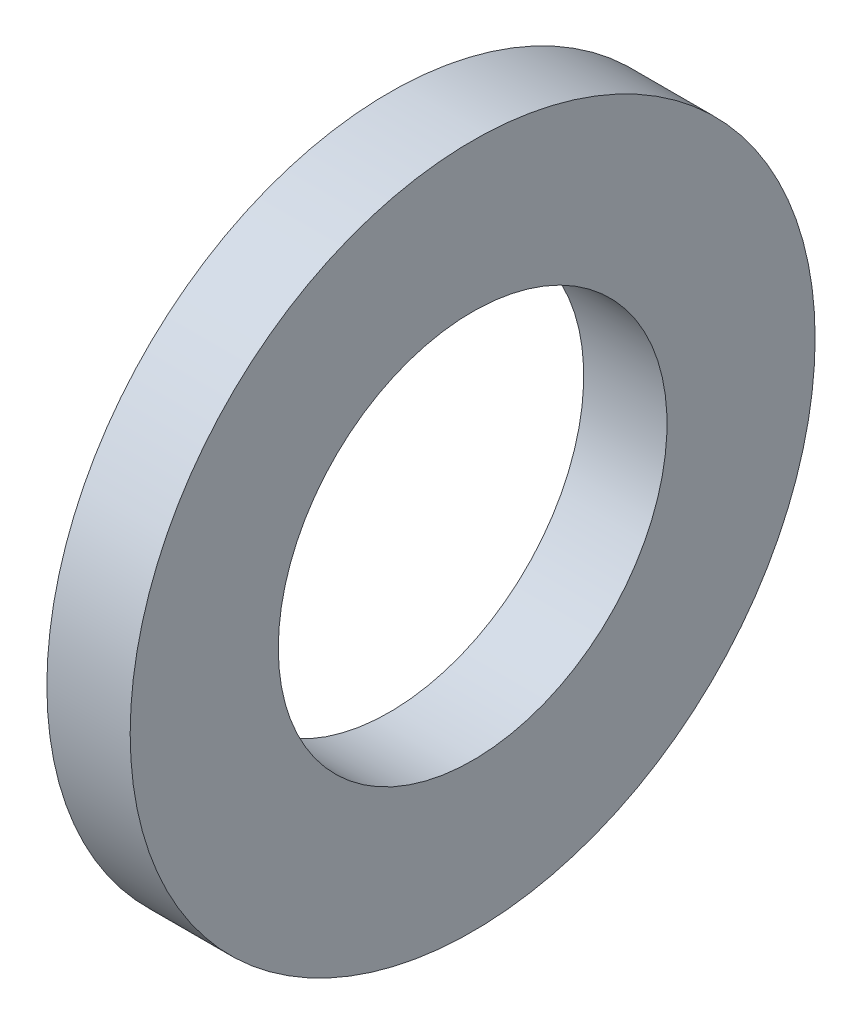
ISO-10303-21;
HEADER;
FILE_DESCRIPTION(('STEP AP214'),'2;1');
FILE_NAME('part.step','',(''),(''),'','','');
FILE_SCHEMA(('AUTOMOTIVE_DESIGN { 1 0 10303 214 1 1 1 1 }'));
ENDSEC;
DATA;
#1=APPLICATION_CONTEXT('core data for automotive mechanical design processes');
#2=APPLICATION_PROTOCOL_DEFINITION('international standard','automotive_design',2000,#1);
#3=PRODUCT_CONTEXT('',#1,'mechanical');
#4=PRODUCT('Part','Part','',(#3));
#5=PRODUCT_RELATED_PRODUCT_CATEGORY('part','',(#4));
#6=PRODUCT_DEFINITION_FORMATION('','',#4);
#7=PRODUCT_DEFINITION_CONTEXT('part definition',#1,'design');
#8=PRODUCT_DEFINITION('design','',#6,#7);
#9=PRODUCT_DEFINITION_SHAPE('','',#8);
#10=(LENGTH_UNIT() NAMED_UNIT(*) SI_UNIT(.MILLI.,.METRE.));
#11=(NAMED_UNIT(*) PLANE_ANGLE_UNIT() SI_UNIT($,.RADIAN.));
#12=(NAMED_UNIT(*) SI_UNIT($,.STERADIAN.) SOLID_ANGLE_UNIT());
#13=UNCERTAINTY_MEASURE_WITH_UNIT(LENGTH_MEASURE(1.E-05),#10,'distance_accuracy_value','');
#14=(GEOMETRIC_REPRESENTATION_CONTEXT(3) GLOBAL_UNCERTAINTY_ASSIGNED_CONTEXT((#13)) GLOBAL_UNIT_ASSIGNED_CONTEXT((#10,
#11,#12)) REPRESENTATION_CONTEXT('',''));
#15=CARTESIAN_POINT('',(0.,0.,0.));
#16=DIRECTION('',(0.,0.,1.));
#17=DIRECTION('',(1.,0.,0.));
#18=AXIS2_PLACEMENT_3D('',#15,#16,#17);
#19=CARTESIAN_POINT('',(-34.9249999999999,0.,0.));
#20=DIRECTION('',(-1.,0.,0.));
#21=DIRECTION('',(0.,0.,1.));
#22=AXIS2_PLACEMENT_3D('',#19,#20,#21);
#23=CYLINDRICAL_SURFACE('',#22,10.5);
#24=CARTESIAN_POINT('',(0.,0.,0.));
#25=DIRECTION('',(-1.,0.,0.));
#26=DIRECTION('',(0.,0.,1.));
#27=AXIS2_PLACEMENT_3D('',#24,#25,#26);
#28=CIRCLE('',#27,10.5);
#29=CARTESIAN_POINT('',(0.,0.,10.5));
#30=VERTEX_POINT('',#29);
#31=EDGE_CURVE('E10',#30,#30,#28,.T.);
#32=ORIENTED_EDGE('',*,*,#31,.F.);
#33=EDGE_LOOP('',(#32));
#34=FACE_BOUND('',#33,.T.);
#35=CARTESIAN_POINT('',(-4.5,0.,0.));
#36=DIRECTION('',(-1.,0.,0.));
#37=DIRECTION('',(0.,0.,1.));
#38=AXIS2_PLACEMENT_3D('',#35,#36,#37);
#39=CIRCLE('',#38,10.5);
#40=CARTESIAN_POINT('',(-4.5,0.,10.5));
#41=VERTEX_POINT('',#40);
#42=EDGE_CURVE('E44',#41,#41,#39,.T.);
#43=ORIENTED_EDGE('',*,*,#42,.T.);
#44=EDGE_LOOP('',(#43));
#45=FACE_BOUND('',#44,.T.);
#46=ADVANCED_FACE('F30',(#34,#45),#23,.F.);
#47=CARTESIAN_POINT('',(0.,10.5,0.));
#48=DIRECTION('',(-1.,0.,0.));
#49=DIRECTION('',(0.,0.,1.));
#50=AXIS2_PLACEMENT_3D('',#47,#48,#49);
#51=PLANE('',#50);
#52=CARTESIAN_POINT('',(0.,0.,0.));
#53=DIRECTION('',(-1.,0.,0.));
#54=DIRECTION('',(0.,0.,1.));
#55=AXIS2_PLACEMENT_3D('',#52,#53,#54);
#56=CIRCLE('',#55,18.5);
#57=CARTESIAN_POINT('',(0.,0.,18.5));
#58=VERTEX_POINT('',#57);
#59=EDGE_CURVE('E36',#58,#58,#56,.T.);
#60=ORIENTED_EDGE('',*,*,#59,.F.);
#61=EDGE_LOOP('',(#60));
#62=FACE_BOUND('',#61,.T.);
#63=ORIENTED_EDGE('',*,*,#31,.T.);
#64=EDGE_LOOP('',(#63));
#65=FACE_BOUND('',#64,.T.);
#66=ADVANCED_FACE('F59',(#62,#65),#51,.F.);
#67=CARTESIAN_POINT('',(-34.9249999999999,0.,0.));
#68=DIRECTION('',(-1.,0.,0.));
#69=DIRECTION('',(0.,0.,1.));
#70=AXIS2_PLACEMENT_3D('',#67,#68,#69);
#71=CYLINDRICAL_SURFACE('',#70,18.5);
#72=CARTESIAN_POINT('',(-4.5,0.,0.));
#73=DIRECTION('',(-1.,0.,0.));
#74=DIRECTION('',(0.,0.,1.));
#75=AXIS2_PLACEMENT_3D('',#72,#73,#74);
#76=CIRCLE('',#75,18.5);
#77=CARTESIAN_POINT('',(-4.5,0.,18.5));
#78=VERTEX_POINT('',#77);
#79=EDGE_CURVE('E40',#78,#78,#76,.T.);
#80=ORIENTED_EDGE('',*,*,#79,.F.);
#81=EDGE_LOOP('',(#80));
#82=FACE_BOUND('',#81,.T.);
#83=ORIENTED_EDGE('',*,*,#59,.T.);
#84=EDGE_LOOP('',(#83));
#85=FACE_BOUND('',#84,.T.);
#86=ADVANCED_FACE('F54',(#82,#85),#71,.T.);
#87=CARTESIAN_POINT('',(-4.5,18.5,0.));
#88=DIRECTION('',(1.,0.,0.));
#89=DIRECTION('',(0.,0.,-1.));
#90=AXIS2_PLACEMENT_3D('',#87,#88,#89);
#91=PLANE('',#90);
#92=ORIENTED_EDGE('',*,*,#42,.F.);
#93=EDGE_LOOP('',(#92));
#94=FACE_BOUND('',#93,.T.);
#95=ORIENTED_EDGE('',*,*,#79,.T.);
#96=EDGE_LOOP('',(#95));
#97=FACE_BOUND('',#96,.T.);
#98=ADVANCED_FACE('F51',(#94,#97),#91,.F.);
#99=CLOSED_SHELL('',(#46,#66,#86,#98));
#100=MANIFOLD_SOLID_BREP('B2',#99);
#101=ADVANCED_BREP_SHAPE_REPRESENTATION('',(#18,#100),#14);
#102=SHAPE_DEFINITION_REPRESENTATION(#9,#101);
ENDSEC;
END-ISO-10303-21;
